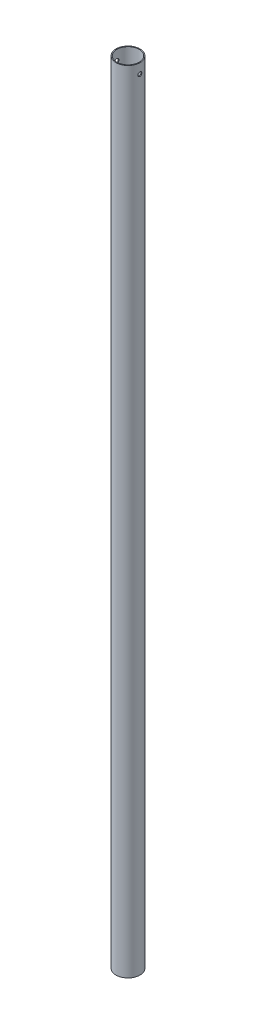
ISO-10303-21;
HEADER;
FILE_DESCRIPTION(('STEP AP214'),'2;1');
FILE_NAME('part.step','',(''),(''),'','','');
FILE_SCHEMA(('AUTOMOTIVE_DESIGN { 1 0 10303 214 1 1 1 1 }'));
ENDSEC;
DATA;
#1=APPLICATION_CONTEXT('core data for automotive mechanical design processes');
#2=APPLICATION_PROTOCOL_DEFINITION('international standard','automotive_design',2000,#1);
#3=PRODUCT_CONTEXT('',#1,'mechanical');
#4=PRODUCT('Part','Part','',(#3));
#5=PRODUCT_RELATED_PRODUCT_CATEGORY('part','',(#4));
#6=PRODUCT_DEFINITION_FORMATION('','',#4);
#7=PRODUCT_DEFINITION_CONTEXT('part definition',#1,'design');
#8=PRODUCT_DEFINITION('design','',#6,#7);
#9=PRODUCT_DEFINITION_SHAPE('','',#8);
#10=(LENGTH_UNIT() NAMED_UNIT(*) SI_UNIT(.MILLI.,.METRE.));
#11=(NAMED_UNIT(*) PLANE_ANGLE_UNIT() SI_UNIT($,.RADIAN.));
#12=(NAMED_UNIT(*) SI_UNIT($,.STERADIAN.) SOLID_ANGLE_UNIT());
#13=UNCERTAINTY_MEASURE_WITH_UNIT(LENGTH_MEASURE(1.E-05),#10,'distance_accuracy_value','');
#14=(GEOMETRIC_REPRESENTATION_CONTEXT(3) GLOBAL_UNCERTAINTY_ASSIGNED_CONTEXT((#13)) GLOBAL_UNIT_ASSIGNED_CONTEXT((#10,
#11,#12)) REPRESENTATION_CONTEXT('',''));
#15=CARTESIAN_POINT('',(0.,0.,0.));
#16=DIRECTION('',(0.,0.,1.));
#17=DIRECTION('',(1.,0.,0.));
#18=AXIS2_PLACEMENT_3D('',#15,#16,#17);
#19=CARTESIAN_POINT('',(0.,990.5,0.));
#20=DIRECTION('',(0.,1.,0.));
#21=DIRECTION('',(0.,0.,1.));
#22=AXIS2_PLACEMENT_3D('',#19,#20,#21);
#23=PLANE('',#22);
#24=CARTESIAN_POINT('',(0.,990.5,0.));
#25=DIRECTION('',(0.,1.,0.));
#26=DIRECTION('',(0.,0.,1.));
#27=AXIS2_PLACEMENT_3D('',#24,#25,#26);
#28=CIRCLE('',#27,30.);
#29=CARTESIAN_POINT('',(0.,990.5,30.));
#30=VERTEX_POINT('',#29);
#31=EDGE_CURVE('E11',#30,#30,#28,.T.);
#32=ORIENTED_EDGE('',*,*,#31,.T.);
#33=EDGE_LOOP('',(#32));
#34=FACE_BOUND('',#33,.T.);
#35=CARTESIAN_POINT('',(0.,990.5,0.));
#36=DIRECTION('',(0.,1.,0.));
#37=DIRECTION('',(1.,0.,0.));
#38=AXIS2_PLACEMENT_3D('',#35,#36,#37);
#39=CIRCLE('',#38,28.);
#40=CARTESIAN_POINT('',(28.,990.5,0.));
#41=VERTEX_POINT('',#40);
#42=EDGE_CURVE('E56',#41,#41,#39,.T.);
#43=ORIENTED_EDGE('',*,*,#42,.F.);
#44=EDGE_LOOP('',(#43));
#45=FACE_BOUND('',#44,.T.);
#46=ADVANCED_FACE('F37',(#34,#45),#23,.T.);
#47=CARTESIAN_POINT('',(0.,-990.5,0.));
#48=DIRECTION('',(0.,1.,0.));
#49=DIRECTION('',(0.,0.,1.));
#50=AXIS2_PLACEMENT_3D('',#47,#48,#49);
#51=PLANE('',#50);
#52=CARTESIAN_POINT('',(0.,-990.5,0.));
#53=DIRECTION('',(0.,1.,0.));
#54=DIRECTION('',(0.,0.,1.));
#55=AXIS2_PLACEMENT_3D('',#52,#53,#54);
#56=CIRCLE('',#55,30.);
#57=CARTESIAN_POINT('',(0.,-990.5,30.));
#58=VERTEX_POINT('',#57);
#59=EDGE_CURVE('E51',#58,#58,#56,.T.);
#60=ORIENTED_EDGE('',*,*,#59,.F.);
#61=EDGE_LOOP('',(#60));
#62=FACE_BOUND('',#61,.T.);
#63=CARTESIAN_POINT('',(0.,-990.5,0.));
#64=DIRECTION('',(0.,1.,0.));
#65=DIRECTION('',(1.,0.,0.));
#66=AXIS2_PLACEMENT_3D('',#63,#64,#65);
#67=CIRCLE('',#66,28.);
#68=CARTESIAN_POINT('',(28.,-990.5,0.));
#69=VERTEX_POINT('',#68);
#70=EDGE_CURVE('E59',#69,#69,#67,.T.);
#71=ORIENTED_EDGE('',*,*,#70,.T.);
#72=EDGE_LOOP('',(#71));
#73=FACE_BOUND('',#72,.T.);
#74=ADVANCED_FACE('F95',(#62,#73),#51,.F.);
#75=CARTESIAN_POINT('',(0.,990.5,0.));
#76=DIRECTION('',(0.,-1.,0.));
#77=DIRECTION('',(0.,0.,-1.));
#78=AXIS2_PLACEMENT_3D('',#75,#76,#77);
#79=CYLINDRICAL_SURFACE('',#78,30.);
#80=CARTESIAN_POINT('',(-30.,960.5,0.));
#81=CARTESIAN_POINT('',(-30.0000009341092,960.499997851397,-0.139438730306518));
#82=CARTESIAN_POINT('',(-29.9990260400444,960.505834755648,-0.27884837499536));
#83=CARTESIAN_POINT('',(-29.9951557115238,960.529134183502,-0.556708896140978));
#84=CARTESIAN_POINT('',(-29.9922598968632,960.546599008604,-0.695159577308843));
#85=CARTESIAN_POINT('',(-29.9846251699259,960.593038812898,-0.97015052034416));
#86=CARTESIAN_POINT('',(-29.979885095025,960.622021052932,-1.10668952072417));
#87=CARTESIAN_POINT('',(-29.9686930297133,960.691286055406,-1.37685247096437));
#88=CARTESIAN_POINT('',(-29.9622404112013,960.731572964316,-1.51047533178691));
#89=CARTESIAN_POINT('',(-29.9478128865369,960.823085001361,-1.77365528085701));
#90=CARTESIAN_POINT('',(-29.9398398129292,960.874296970678,-1.90321704710933));
#91=CARTESIAN_POINT('',(-29.9225843720657,960.987331768374,-2.15759207174612));
#92=CARTESIAN_POINT('',(-29.9133015225275,961.049158507121,-2.28240355940388));
#93=CARTESIAN_POINT('',(-29.8936901460056,961.182931112383,-2.52631223217167));
#94=CARTESIAN_POINT('',(-29.8833621400859,961.254871943398,-2.6454122215292));
#95=CARTESIAN_POINT('',(-29.8619368035706,961.408417322423,-2.8772007594364));
#96=CARTESIAN_POINT('',(-29.8508391875783,961.490025463417,-2.98988690101173));
#97=CARTESIAN_POINT('',(-29.8280901061561,961.66302595166,-3.20893550320273));
#98=CARTESIAN_POINT('',(-29.8164348485225,961.754492970354,-3.31523860199372));
#99=CARTESIAN_POINT('',(-29.792977049997,961.946055893728,-3.51981905081328));
#100=CARTESIAN_POINT('',(-29.7811744561748,962.046154980491,-3.61809341494841));
#101=CARTESIAN_POINT('',(-29.757760553176,962.254234434271,-3.80586900468398));
#102=CARTESIAN_POINT('',(-29.7461491869625,962.362212397114,-3.89537288715648));
#103=CARTESIAN_POINT('',(-29.7234367117224,962.58537924259,-4.06505128766862));
#104=CARTESIAN_POINT('',(-29.7123357924676,962.700570770057,-4.14522235269035));
#105=CARTESIAN_POINT('',(-29.6909016370194,962.938028525306,-4.29606801839333));
#106=CARTESIAN_POINT('',(-29.6805732300208,963.060331931777,-4.36668480543057));
#107=CARTESIAN_POINT('',(-29.6610510502017,963.310589086649,-4.49737903615683));
#108=CARTESIAN_POINT('',(-29.6518577016161,963.438544923565,-4.55745254274494));
#109=CARTESIAN_POINT('',(-29.6348831234285,963.699119311015,-4.66655756396112));
#110=CARTESIAN_POINT('',(-29.6271012976113,963.831735864512,-4.71559374278068));
#111=CARTESIAN_POINT('',(-29.6131700678879,964.100732309735,-4.80229722760726));
#112=CARTESIAN_POINT('',(-29.6070212600786,964.237113555679,-4.83996038282923));
#113=CARTESIAN_POINT('',(-29.5914227981395,964.647801475856,-4.93477467758656));
#114=CARTESIAN_POINT('',(-29.5846386003063,964.92636886537,-4.97488357358491));
#115=CARTESIAN_POINT('',(-29.5790755483693,965.486203158384,-5.00784793424049));
#116=CARTESIAN_POINT('',(-29.5802961277241,965.767469869432,-5.00070674304216));
#117=CARTESIAN_POINT('',(-29.590529429811,966.321844478573,-4.93978637434364));
#118=CARTESIAN_POINT('',(-29.5994616948564,966.595006593739,-4.88648873937529));
#119=CARTESIAN_POINT('',(-29.6239896757343,967.128445649112,-4.73550730524637));
#120=CARTESIAN_POINT('',(-29.6395856201047,967.388722147052,-4.63782198375661));
#121=CARTESIAN_POINT('',(-29.6757696483376,967.890456833719,-4.40035421574886));
#122=CARTESIAN_POINT('',(-29.6963813586744,968.131818594179,-4.26037175365467));
#123=CARTESIAN_POINT('',(-29.7402583517709,968.587809019078,-3.94242410922574));
#124=CARTESIAN_POINT('',(-29.7635238486315,968.802435523655,-3.76445586128017));
#125=CARTESIAN_POINT('',(-29.8104405621052,969.201652112141,-3.37296440409904));
#126=CARTESIAN_POINT('',(-29.8340929858412,969.38583702115,-3.1590279223279));
#127=CARTESIAN_POINT('',(-29.8788520267263,969.715755541261,-2.70307050338167));
#128=CARTESIAN_POINT('',(-29.8999586274719,969.861488904615,-2.46104938526712));
#129=CARTESIAN_POINT('',(-29.9372778581815,970.11040445002,-1.95541183087798));
#130=CARTESIAN_POINT('',(-29.9534863682324,970.213550837604,-1.69177745073246));
#131=CARTESIAN_POINT('',(-29.9791500601698,970.37398843155,-1.15059669160241));
#132=CARTESIAN_POINT('',(-29.988605806999,970.431283473929,-0.873051478491212));
#133=CARTESIAN_POINT('',(-29.999622596864,970.497842716941,-0.315419802472582));
#134=CARTESIAN_POINT('',(-30.0012750602153,970.507663144718,-0.035401474169993));
#135=CARTESIAN_POINT('',(-29.9967494884638,970.480477310037,0.52227954564772));
#136=CARTESIAN_POINT('',(-29.9905717546544,970.443472849323,0.799942327386585));
#137=CARTESIAN_POINT('',(-29.971136538593,970.324150305711,1.34331235148858));
#138=CARTESIAN_POINT('',(-29.9579220953842,970.242107599602,1.6090817382158));
#139=CARTESIAN_POINT('',(-29.9258892897492,970.035330947217,2.12309376827572));
#140=CARTESIAN_POINT('',(-29.9070706126377,969.910594603576,2.3713354264338));
#141=CARTESIAN_POINT('',(-29.8656903236297,969.620697812301,2.84566138437112));
#142=CARTESIAN_POINT('',(-29.8430971086773,969.455189918858,3.07153052223235));
#143=CARTESIAN_POINT('',(-29.7967693569018,969.088925138021,3.4924871506458));
#144=CARTESIAN_POINT('',(-29.7730347372687,968.88816569028,3.68757240338598));
#145=CARTESIAN_POINT('',(-29.7268034705286,968.454605775965,4.04348563611059));
#146=CARTESIAN_POINT('',(-29.7043221945332,968.221494939448,4.20393781021316));
#147=CARTESIAN_POINT('',(-29.6634307237625,967.73129079135,4.48340433261343));
#148=CARTESIAN_POINT('',(-29.6450203999454,967.474198240312,4.60241999444136));
#149=CARTESIAN_POINT('',(-29.6144685973239,966.944432692722,4.79507773356381));
#150=CARTESIAN_POINT('',(-29.602301310812,966.671829098809,4.86890685306044));
#151=CARTESIAN_POINT('',(-29.5855561119601,966.117714456625,4.96966691993878));
#152=CARTESIAN_POINT('',(-29.580977539818,965.836204184916,4.99660194454599));
#153=CARTESIAN_POINT('',(-29.5801885462874,965.415590216582,5.00123212445091));
#154=CARTESIAN_POINT('',(-29.5809172344068,965.276463077976,4.99693975789019));
#155=CARTESIAN_POINT('',(-29.5843160283654,964.999087415514,4.97678436801742));
#156=CARTESIAN_POINT('',(-29.5869854047428,964.860838581215,4.96092569221814));
#157=CARTESIAN_POINT('',(-29.5941926651669,964.586152210723,4.91774640529923));
#158=CARTESIAN_POINT('',(-29.5987312164982,964.449715339365,4.89042170080806));
#159=CARTESIAN_POINT('',(-29.6095423170401,964.179703545125,4.82453301754962));
#160=CARTESIAN_POINT('',(-29.615814242021,964.046127610574,4.78597308458853));
#161=CARTESIAN_POINT('',(-29.6299071307842,963.782831394878,4.69793428640033));
#162=CARTESIAN_POINT('',(-29.6377268263816,963.653108056479,4.64846435664854));
#163=CARTESIAN_POINT('',(-29.6546930297384,963.398341273562,4.53896986674986));
#164=CARTESIAN_POINT('',(-29.6638390620139,963.273296172049,4.47894908739064));
#165=CARTESIAN_POINT('',(-29.6832065043881,963.028638549201,4.34874498523016));
#166=CARTESIAN_POINT('',(-29.6934283356131,962.909028181745,4.27855767862005));
#167=CARTESIAN_POINT('',(-29.7146554589665,962.676138474368,4.12855715704196));
#168=CARTESIAN_POINT('',(-29.7256604751555,962.562856929479,4.04874732556533));
#169=CARTESIAN_POINT('',(-29.7482907408856,962.341991301298,3.87899685367999));
#170=CARTESIAN_POINT('',(-29.7599219326499,962.234493909896,3.78894418512198));
#171=CARTESIAN_POINT('',(-29.783347263822,962.027486603521,3.60017574898992));
#172=CARTESIAN_POINT('',(-29.7951413435574,961.927973849904,3.50146308651917));
#173=CARTESIAN_POINT('',(-29.8185735949796,961.737518070023,3.29596225179818));
#174=CARTESIAN_POINT('',(-29.8302116694714,961.646580190969,3.18916929766625));
#175=CARTESIAN_POINT('',(-29.8529952569281,961.474004283895,2.96833108680551));
#176=CARTESIAN_POINT('',(-29.8641409501131,961.392362835665,2.85428852146922));
#177=CARTESIAN_POINT('',(-29.8857116363867,961.238354969589,2.6188382428721));
#178=CARTESIAN_POINT('',(-29.896130775176,961.166060601068,2.49738284629917));
#179=CARTESIAN_POINT('',(-29.9158586577262,961.032003252814,2.24876507402075));
#180=CARTESIAN_POINT('',(-29.925167809621,960.970236398583,2.12160481976541));
#181=CARTESIAN_POINT('',(-29.9424090895346,960.857699293732,1.86251821435406));
#182=CARTESIAN_POINT('',(-29.950342172599,960.806921410225,1.73059524615481));
#183=CARTESIAN_POINT('',(-29.9646113279921,960.716705181105,1.46288984328886));
#184=CARTESIAN_POINT('',(-29.9709477429356,960.677264402506,1.3271082435821));
#185=CARTESIAN_POINT('',(-29.9841083147641,960.59602169883,0.995492141379865));
#186=CARTESIAN_POINT('',(-29.9900398634941,960.560056342968,0.798161887183521));
#187=CARTESIAN_POINT('',(-29.9979850016837,960.512047242201,0.400534394814466));
#188=CARTESIAN_POINT('',(-29.9999986585978,960.500003085443,0.200237207783453));
#189=CARTESIAN_POINT('',(-30.,960.5,0.));
#190=B_SPLINE_CURVE_WITH_KNOTS('',3,(#80,#81,#82,#83,#84,#85,#86,#87,#88,#89,#90,#91,#92,#93,
#94,#95,#96,#97,#98,#99,#100,#101,#102,#103,#104,#105,#106,#107,#108,#109,#110,#111,#112,#113,
#114,#115,#116,#117,#118,#119,#120,#121,#122,#123,#124,#125,#126,#127,#128,#129,#130,#131,#132,
#133,#134,#135,#136,#137,#138,#139,#140,#141,#142,#143,#144,#145,#146,#147,#148,#149,#150,#151,
#152,#153,#154,#155,#156,#157,#158,#159,#160,#161,#162,#163,#164,#165,#166,#167,#168,#169,#170,
#171,#172,#173,#174,#175,#176,#177,#178,#179,#180,#181,#182,#183,#184,#185,#186,#187,#188,#189),
.UNSPECIFIED.,.T.,.F.,(4,2,2,2,2,2,2,2,2,2,2,2,2,2,2,2,2,2,2,2,2,2,2,2,2,2,2,2,2,2,2,2,2,2,2,2,
2,2,2,2,2,2,2,2,2,2,2,2,2,2,2,2,2,2,4),(0.,0.41814067763632,0.836364141924735,1.25485168316259,
1.67349292366113,2.0916327453657,2.50992693714586,2.92801360569253,3.34625615217359,
3.76792473637704,4.18974943231202,4.61144594582067,5.03329798883919,5.45759827861691,
5.88205667621394,6.30633536657084,6.73076871826466,7.57090272280942,8.41097726715884,
9.24239161594911,10.0738344812487,10.9092723133921,11.7447775943526,12.5906365789677,
13.436501013458,14.2830749590591,15.1295780711641,15.9661388505691,16.8026674414583,
17.6341373208694,18.4656538972624,19.3045176932816,20.1434424418268,20.9910576208936,
21.83864592826,22.6827016275766,23.5266839364735,23.9438629667131,24.3608852695981,
24.7780565762498,25.1950778447662,25.6117588257789,26.0282907967258,26.4449864317717,
26.8615359724481,27.2831832626948,27.7046799813851,28.1264281209232,28.5480205921467,
28.9726903230862,29.3972034214197,29.8214207018257,30.2455468755531,30.8460167962321,
31.4464763784911),.UNSPECIFIED.);
#191=CARTESIAN_POINT('',(-30.,960.5,0.));
#192=VERTEX_POINT('',#191);
#193=EDGE_CURVE('E84',#192,#192,#190,.T.);
#194=ORIENTED_EDGE('',*,*,#193,.T.);
#195=EDGE_LOOP('',(#194));
#196=FACE_BOUND('',#195,.T.);
#197=CARTESIAN_POINT('',(29.5803989154981,965.5,-5.00000000000001));
#198=CARTESIAN_POINT('',(29.5803979326159,965.360576396262,-5.00000215212788));
#199=CARTESIAN_POINT('',(29.5813865662228,965.221181880358,-4.99416650120511));
#200=CARTESIAN_POINT('',(29.5853101778166,964.943352026624,-4.97087220441201));
#201=CARTESIAN_POINT('',(29.5882455414312,964.804916884328,-4.95341125568433));
#202=CARTESIAN_POINT('',(29.595980767529,964.529957352483,-4.90698205316679));
#203=CARTESIAN_POINT('',(29.6007818099767,964.393434228934,-4.87800651661559));
#204=CARTESIAN_POINT('',(29.6121103008977,964.12330337378,-4.80875805511331));
#205=CARTESIAN_POINT('',(29.618638383252,963.98969673215,-4.76848098179352));
#206=CARTESIAN_POINT('',(29.6332225751521,963.726551289933,-4.67699269476573));
#207=CARTESIAN_POINT('',(29.6412768169069,963.597007740269,-4.62579483693732));
#208=CARTESIAN_POINT('',(29.6586914491271,963.342667598529,-4.51279168660922));
#209=CARTESIAN_POINT('',(29.6680523207879,963.217872776923,-4.45098248431029));
#210=CARTESIAN_POINT('',(29.6878078821124,962.973994486096,-4.31724764429025));
#211=CARTESIAN_POINT('',(29.6982020583187,962.854908223419,-4.24532702372851));
#212=CARTESIAN_POINT('',(29.7197406344104,962.623143403145,-4.09182393832119));
#213=CARTESIAN_POINT('',(29.7308853125904,962.510467251377,-4.01023788081431));
#214=CARTESIAN_POINT('',(29.7537075193766,962.291405187077,-3.83725956163015));
#215=CARTESIAN_POINT('',(29.765388757594,962.185080538645,-3.7457901948867));
#216=CARTESIAN_POINT('',(29.7888712088753,961.98045677902,-3.55421801378067));
#217=CARTESIAN_POINT('',(29.8006724647591,961.882160653901,-3.45411201537787));
#218=CARTESIAN_POINT('',(29.8240565154478,961.694342466883,-3.24601440777822));
#219=CARTESIAN_POINT('',(29.8356393762872,961.604817717345,-3.13802523187877));
#220=CARTESIAN_POINT('',(29.8582708932577,961.435099163083,-2.91483167477466));
#221=CARTESIAN_POINT('',(29.8693193508737,961.35490881049,-2.79962464827635));
#222=CARTESIAN_POINT('',(29.8906281533999,961.204041140909,-2.56215441101309));
#223=CARTESIAN_POINT('',(29.9008837226048,961.133419792008,-2.4398551986927));
#224=CARTESIAN_POINT('',(29.9202504077895,961.002716002867,-2.18960603977589));
#225=CARTESIAN_POINT('',(29.9293610959132,960.94263749931,-2.06165400465139));
#226=CARTESIAN_POINT('',(29.9461700436224,960.833522236651,-1.80108735309578));
#227=CARTESIAN_POINT('',(29.9538688966168,960.784480836562,-1.66847472361842));
#228=CARTESIAN_POINT('',(29.9676431912185,960.697766756876,-1.39948700260425));
#229=CARTESIAN_POINT('',(29.9737180397443,960.660098229971,-1.26311055653701));
#230=CARTESIAN_POINT('',(29.9891228124451,960.565269031055,-0.852446509264983));
#231=CARTESIAN_POINT('',(29.9958138795881,960.525148659063,-0.573900376996239));
#232=CARTESIAN_POINT('',(30.0013047692693,960.492154001607,-0.0141079703099824));
#233=CARTESIAN_POINT('',(30.000105128181,960.499276504794,0.267138119279332));
#234=CARTESIAN_POINT('',(29.9900163282399,960.56016652949,0.821593120474296));
#235=CARTESIAN_POINT('',(29.9812034486287,960.613471352281,1.09485404654844));
#236=CARTESIAN_POINT('',(29.9569598006588,960.764501122999,1.62848697416716));
#237=CARTESIAN_POINT('',(29.9415288307432,960.862227423808,1.8888585828924));
#238=CARTESIAN_POINT('',(29.9056539094833,961.099781557263,2.39071148226921));
#239=CARTESIAN_POINT('',(29.885187330251,961.239800098321,2.63210082802066));
#240=CARTESIAN_POINT('',(29.8415147777179,961.557825571108,3.08813127772831));
#241=CARTESIAN_POINT('',(29.8183085827714,961.735835577439,3.30277021457951));
#242=CARTESIAN_POINT('',(29.77140536021,962.127357633464,3.70194248743279));
#243=CARTESIAN_POINT('',(29.7477057934308,962.341274195222,3.88607898857915));
#244=CARTESIAN_POINT('',(29.7027591968862,962.797174175011,4.21590919282352));
#245=CARTESIAN_POINT('',(29.6815121897447,963.039157851911,4.3616025413131));
#246=CARTESIAN_POINT('',(29.6438750909177,963.544783285212,4.61048886472354));
#247=CARTESIAN_POINT('',(29.6274904659697,963.808448996581,4.71363405349993));
#248=CARTESIAN_POINT('',(29.6015237738799,964.349698144218,4.87405974268971));
#249=CARTESIAN_POINT('',(29.5919411077771,964.627280352733,4.93134428151734));
#250=CARTESIAN_POINT('',(29.5807791884317,965.184932312455,4.99786376977689));
#251=CARTESIAN_POINT('',(29.5791057152116,965.464932759536,5.0076644169312));
#252=CARTESIAN_POINT('',(29.583700695609,966.02257334325,4.98044540425866));
#253=CARTESIAN_POINT('',(29.5899688424735,966.300213570631,4.94342755284268));
#254=CARTESIAN_POINT('',(29.6096537492629,966.843455518776,4.82410467423496));
#255=CARTESIAN_POINT('',(29.6230250389774,967.109122281198,4.74208759766015));
#256=CARTESIAN_POINT('',(29.6553714594995,967.622940331118,4.53539636401616));
#257=CARTESIAN_POINT('',(29.6743469255321,967.87109056973,4.41071965510571));
#258=CARTESIAN_POINT('',(29.7159825702484,968.345349194234,4.12091340811817));
#259=CARTESIAN_POINT('',(29.7386751206295,968.571233165831,3.95542135942321));
#260=CARTESIAN_POINT('',(29.7850933249741,968.992227045069,3.58917870029519));
#261=CARTESIAN_POINT('',(29.8088190515135,969.187334786356,3.38842560992095));
#262=CARTESIAN_POINT('',(29.8549284748932,969.543303862109,2.95485701247837));
#263=CARTESIAN_POINT('',(29.8772956488783,969.703787940026,2.72172977623547));
#264=CARTESIAN_POINT('',(29.9179021266779,969.983310366562,2.23148362654157));
#265=CARTESIAN_POINT('',(29.9361415640095,970.102350055822,1.97436548948835));
#266=CARTESIAN_POINT('',(29.9663676167788,970.295022236316,1.44461025477477));
#267=CARTESIAN_POINT('',(29.9783813800026,970.368852130772,1.1720463847414));
#268=CARTESIAN_POINT('',(29.9949099748744,970.469627218953,0.618016213936846));
#269=CARTESIAN_POINT('',(29.999425423549,970.496576270453,0.336550647617436));
#270=CARTESIAN_POINT('',(30.0002084581204,970.501239001663,-0.0840513236234776));
#271=CARTESIAN_POINT('',(29.999491569583,970.496955250037,-0.223209655690172));
#272=CARTESIAN_POINT('',(29.9961418479859,970.476811799166,-0.500648669793277));
#273=CARTESIAN_POINT('',(29.9935097346187,970.460956448226,-0.638929661828186));
#274=CARTESIAN_POINT('',(29.9863985702464,970.417778301235,-0.913680965571314));
#275=CARTESIAN_POINT('',(29.9819188631118,970.390451431282,-1.05015061623523));
#276=CARTESIAN_POINT('',(29.9712403869649,970.324552637904,-1.32022824391749));
#277=CARTESIAN_POINT('',(29.9650422374513,970.285984766604,-1.45383723354139));
#278=CARTESIAN_POINT('',(29.95110323313,970.197922026297,-1.71720548972896));
#279=CARTESIAN_POINT('',(29.9433635637899,970.14843555084,-1.84696762706267));
#280=CARTESIAN_POINT('',(29.9265550855046,970.038901336116,-2.10180951631917));
#281=CARTESIAN_POINT('',(29.9174867532583,969.978857383134,-2.22689092747554));
#282=CARTESIAN_POINT('',(29.8982638774694,969.848601112338,-2.47161697545374));
#283=CARTESIAN_POINT('',(29.8881089104257,969.778384826198,-2.59125946645752));
#284=CARTESIAN_POINT('',(29.8669972490416,969.628321552099,-2.82420799916345));
#285=CARTESIAN_POINT('',(29.8560408372885,969.548477952327,-2.93751624967612));
#286=CARTESIAN_POINT('',(29.8334892153085,969.378690446336,-3.15838432816086));
#287=CARTESIAN_POINT('',(29.8218879813952,969.288638226688,-3.26586029407922));
#288=CARTESIAN_POINT('',(29.7984955265668,969.09987513112,-3.47282432265102));
#289=CARTESIAN_POINT('',(29.7867043749739,969.001167358622,-3.57231522401808));
#290=CARTESIAN_POINT('',(29.7632506471209,968.795680670506,-3.76272784850016));
#291=CARTESIAN_POINT('',(29.7515881521716,968.688896952148,-3.85364439911048));
#292=CARTESIAN_POINT('',(29.7287311492829,968.468081544253,-4.02617893630586));
#293=CARTESIAN_POINT('',(29.7175364703669,968.3540525418,-4.10780033921654));
#294=CARTESIAN_POINT('',(29.6958464681929,968.118613436289,-4.26178317336446));
#295=CARTESIAN_POINT('',(29.6853569910252,967.997154577476,-4.33407091155744));
#296=CARTESIAN_POINT('',(29.6654772768531,967.748530651649,-4.46811470952362));
#297=CARTESIAN_POINT('',(29.6560866358151,967.621367705925,-4.52987464412771));
#298=CARTESIAN_POINT('',(29.6386805621146,967.36227598754,-4.64239786264881));
#299=CARTESIAN_POINT('',(29.6306641722598,967.230350610174,-4.69316880713278));
#300=CARTESIAN_POINT('',(29.6162360630624,966.96263975731,-4.7833713057041));
#301=CARTESIAN_POINT('',(29.6098239987682,966.826855118609,-4.82280529766024));
#302=CARTESIAN_POINT('',(29.596502515164,966.495277925421,-4.90401989376));
#303=CARTESIAN_POINT('',(29.5904931161671,966.297990596502,-4.93996956730933));
#304=CARTESIAN_POINT('',(29.5824420579954,965.900448818702,-4.98795785830044));
#305=CARTESIAN_POINT('',(29.5804003267909,965.700194423752,-4.99999690982025));
#306=CARTESIAN_POINT('',(29.5803989154981,965.5,-5.00000000000001));
#307=B_SPLINE_CURVE_WITH_KNOTS('',3,(#197,#198,#199,#200,#201,#202,#203,#204,#205,#206,#207,
#208,#209,#210,#211,#212,#213,#214,#215,#216,#217,#218,#219,#220,#221,#222,#223,#224,#225,#226,
#227,#228,#229,#230,#231,#232,#233,#234,#235,#236,#237,#238,#239,#240,#241,#242,#243,#244,#245,
#246,#247,#248,#249,#250,#251,#252,#253,#254,#255,#256,#257,#258,#259,#260,#261,#262,#263,#264,
#265,#266,#267,#268,#269,#270,#271,#272,#273,#274,#275,#276,#277,#278,#279,#280,#281,#282,#283,
#284,#285,#286,#287,#288,#289,#290,#291,#292,#293,#294,#295,#296,#297,#298,#299,#300,#301,#302,
#303,#304,#305,#306),.UNSPECIFIED.,.T.,.F.,(4,2,2,2,2,2,2,2,2,2,2,2,2,2,2,2,2,2,2,2,2,2,2,2,2,2,
2,2,2,2,2,2,2,2,2,2,2,2,2,2,2,2,2,2,2,2,2,2,2,2,2,2,2,2,4),(0.,0.418095242549684,
0.836273330312904,1.25471632992742,1.67331312559434,2.09140089204113,2.50964303678584,
2.92767838265866,3.345869603489,3.76759791918747,4.18948238202704,4.61123716813958,
5.03314743913421,5.45742771408337,5.88186607917444,6.30612563749767,6.73053992314494,
7.57061257037397,8.41062811397651,9.24232364421605,10.0740445059133,10.9095733037112,
11.745169745458,12.5909036901652,13.436645435843,14.2833344708949,15.1299489396843,
15.9664520693309,16.8029228892024,17.6341025136327,18.4653318667942,19.3042280761769,
20.1431833095364,20.9908634816303,21.8385162304567,22.6824409092756,23.5262961391698,
23.9435677338948,24.3606826095272,24.7779457414127,25.1950586450546,25.6118520083923,
26.0284961987166,26.4453033659292,26.8619642700311,27.2835543146455,27.7049938127193,
28.126685940746,28.5482225769884,28.9729067446498,29.3974342652836,29.8216648822649,
30.2458042054463,30.8461462814326,31.4464774585936),.UNSPECIFIED.);
#308=CARTESIAN_POINT('',(29.5803989154981,965.5,-5.00000000000001));
#309=VERTEX_POINT('',#308);
#310=EDGE_CURVE('E79',#309,#309,#307,.T.);
#311=ORIENTED_EDGE('',*,*,#310,.T.);
#312=EDGE_LOOP('',(#311));
#313=FACE_BOUND('',#312,.T.);
#314=ORIENTED_EDGE('',*,*,#31,.F.);
#315=EDGE_LOOP('',(#314));
#316=FACE_BOUND('',#315,.T.);
#317=ORIENTED_EDGE('',*,*,#59,.T.);
#318=EDGE_LOOP('',(#317));
#319=FACE_BOUND('',#318,.T.);
#320=ADVANCED_FACE('F39',(#196,#313,#316,#319),#79,.T.);
#321=CARTESIAN_POINT('',(0.,990.5,0.));
#322=DIRECTION('',(0.,-1.,0.));
#323=DIRECTION('',(0.,0.,-1.));
#324=AXIS2_PLACEMENT_3D('',#321,#322,#323);
#325=CYLINDRICAL_SURFACE('',#324,28.);
#326=CARTESIAN_POINT('',(-27.5499546279118,965.5,-5.00000000000001));
#327=CARTESIAN_POINT('',(-27.5499534785113,965.639267090309,-5.00000235394525));
#328=CARTESIAN_POINT('',(-27.5510126599751,965.778503213249,-4.99417968710046));
#329=CARTESIAN_POINT('',(-27.5552158522054,966.056015107577,-4.97093843407888));
#330=CARTESIAN_POINT('',(-27.558360255738,966.194290693082,-4.95351766331636));
#331=CARTESIAN_POINT('',(-27.5666457352828,966.468924724803,-4.90719805539984));
#332=CARTESIAN_POINT('',(-27.5717879996025,966.605281979904,-4.87829238691191));
#333=CARTESIAN_POINT('',(-27.5839207236134,966.875081856278,-4.80921478686572));
#334=CARTESIAN_POINT('',(-27.5909118624483,967.008523386985,-4.76903871504114));
#335=CARTESIAN_POINT('',(-27.6065289529866,967.271335237038,-4.67778760049008));
#336=CARTESIAN_POINT('',(-27.6151528151451,967.400710516241,-4.62672647794613));
#337=CARTESIAN_POINT('',(-27.6337977727396,967.654723007349,-4.51403163823147));
#338=CARTESIAN_POINT('',(-27.6438193830619,967.779358451619,-4.45239402307846));
#339=CARTESIAN_POINT('',(-27.6649685733021,968.022935291171,-4.31903543922292));
#340=CARTESIAN_POINT('',(-27.6760956233637,968.1418793743,-4.24731929456353));
#341=CARTESIAN_POINT('',(-27.6991524939337,968.3733816399,-4.09425705215796));
#342=CARTESIAN_POINT('',(-27.711082612651,968.485937421244,-4.01290736851647));
#343=CARTESIAN_POINT('',(-27.7355297067602,968.704928339126,-3.8403201822788));
#344=CARTESIAN_POINT('',(-27.7480512719506,968.81129305134,-3.74899395863677));
#345=CARTESIAN_POINT('',(-27.7732247238632,969.016011556321,-3.5577092512307));
#346=CARTESIAN_POINT('',(-27.7858766571367,969.114362367375,-3.45774758273872));
#347=CARTESIAN_POINT('',(-27.8109487865459,969.302308002275,-3.24993462722937));
#348=CARTESIAN_POINT('',(-27.8233690518608,969.391905474979,-3.14208574435405));
#349=CARTESIAN_POINT('',(-27.8476400296906,969.561788771104,-2.91916394879762));
#350=CARTESIAN_POINT('',(-27.8594905305788,969.642071150043,-2.80408838796573));
#351=CARTESIAN_POINT('',(-27.8823608982083,969.793211950455,-2.56675882950058));
#352=CARTESIAN_POINT('',(-27.8933748300241,969.864005350994,-2.44446283153361));
#353=CARTESIAN_POINT('',(-27.9141773953462,969.995051336245,-2.19419156577699));
#354=CARTESIAN_POINT('',(-27.9239655701264,970.05529997803,-2.06621419592124));
#355=CARTESIAN_POINT('',(-27.9420285438388,970.164748737473,-1.80556855851417));
#356=CARTESIAN_POINT('',(-27.9503039900596,970.213953582776,-1.67290232643799));
#357=CARTESIAN_POINT('',(-27.9651145246266,970.300983498083,-1.40377971328896));
#358=CARTESIAN_POINT('',(-27.971648978394,970.338804419382,-1.26732197019643));
#359=CARTESIAN_POINT('',(-27.988212780726,970.433978602455,-0.856746536079207));
#360=CARTESIAN_POINT('',(-27.995422125896,970.474330269703,-0.578348870457847));
#361=CARTESIAN_POINT('',(-28.0013939639513,970.507824417747,-0.0188008419929522));
#362=CARTESIAN_POINT('',(-28.0001571119632,970.500970560026,0.262349305666016));
#363=CARTESIAN_POINT('',(-27.9894550221657,970.440692654159,0.816234742859477));
#364=CARTESIAN_POINT('',(-27.9800834531563,970.387798724366,1.08902935138809));
#365=CARTESIAN_POINT('',(-27.9542657455603,970.23776205265,1.62179704102249));
#366=CARTESIAN_POINT('',(-27.9378193673122,970.140617811726,1.88176968744748));
#367=CARTESIAN_POINT('',(-27.8995430389697,969.904327750489,2.38308222368494));
#368=CARTESIAN_POINT('',(-27.8776856576117,969.764967081395,2.62431867879868));
#369=CARTESIAN_POINT('',(-27.8310092576256,969.448356796571,3.0801804998146));
#370=CARTESIAN_POINT('',(-27.8061899649772,969.271103674031,3.29480339982154));
#371=CARTESIAN_POINT('',(-27.7559361731104,968.880809755668,3.69448475893714));
#372=CARTESIAN_POINT('',(-27.7304979191709,968.66730521887,3.87909018386607));
#373=CARTESIAN_POINT('',(-27.6822051338596,968.212121589109,4.20993574078193));
#374=CARTESIAN_POINT('',(-27.6593506336834,967.970442156043,4.35617540957932));
#375=CARTESIAN_POINT('',(-27.6188090530137,967.465201902739,4.60624959232788));
#376=CARTESIAN_POINT('',(-27.6011293946448,967.201610343108,4.71002328260462));
#377=CARTESIAN_POINT('',(-27.5730566697062,966.660348375577,4.87168806226294));
#378=CARTESIAN_POINT('',(-27.5626628597676,966.382679407084,4.92958383260836));
#379=CARTESIAN_POINT('',(-27.5504843540192,965.825215808988,4.99719832412839));
#380=CARTESIAN_POINT('',(-27.548583758827,965.545502305972,5.00756567457422));
#381=CARTESIAN_POINT('',(-27.5532973691619,964.988339326097,4.98156323522329));
#382=CARTESIAN_POINT('',(-27.5599111947094,964.71088974876,4.94519553110779));
#383=CARTESIAN_POINT('',(-27.5808008649167,964.168230835083,4.82731052169665));
#384=CARTESIAN_POINT('',(-27.5950197240868,963.902946193396,4.74612886969043));
#385=CARTESIAN_POINT('',(-27.6294688283561,963.389745376983,4.54127465387027));
#386=CARTESIAN_POINT('',(-27.6496994801379,963.141830378672,4.41759921537033));
#387=CARTESIAN_POINT('',(-27.6941590073013,962.667535741828,4.1297587621799));
#388=CARTESIAN_POINT('',(-27.7184277145815,962.441410163424,3.96518138339145));
#389=CARTESIAN_POINT('',(-27.7681148582862,962.019751509308,3.60076821540068));
#390=CARTESIAN_POINT('',(-27.7935333879457,961.824220920189,3.40092956316172));
#391=CARTESIAN_POINT('',(-27.8430261700389,961.466903296362,2.96878356144963));
#392=CARTESIAN_POINT('',(-27.8670805524709,961.305550882274,2.73611425506022));
#393=CARTESIAN_POINT('',(-27.9108069263097,961.024228153642,2.24658264882748));
#394=CARTESIAN_POINT('',(-27.9304790750142,960.904256353679,1.98972121781733));
#395=CARTESIAN_POINT('',(-27.9631406686226,960.709757928253,1.46039089185689));
#396=CARTESIAN_POINT('',(-27.9761623553305,960.635011714211,1.1880045538304));
#397=CARTESIAN_POINT('',(-27.9941852090498,960.532399285306,0.634135279903124));
#398=CARTESIAN_POINT('',(-27.9991871382014,960.504528615717,0.352653210989321));
#399=CARTESIAN_POINT('',(-28.0002663085864,960.498520264034,-0.0678392147903165));
#400=CARTESIAN_POINT('',(-27.9995803509125,960.502344762964,-0.206812286370632));
#401=CARTESIAN_POINT('',(-27.9961595752054,960.521539266882,-0.483919338398537));
#402=CARTESIAN_POINT('',(-27.9934255291847,960.536904921519,-0.622053615250291));
#403=CARTESIAN_POINT('',(-27.9859800024487,960.579075467747,-0.89654980403939));
#404=CARTESIAN_POINT('',(-27.9812678249643,960.605884390125,-1.03291107399429));
#405=CARTESIAN_POINT('',(-27.9700002441596,960.670721215827,-1.30281182539596));
#406=CARTESIAN_POINT('',(-27.9634455031696,960.708745088051,-1.43635230229758));
#407=CARTESIAN_POINT('',(-27.9486814052143,960.79568039397,-1.69957891416049));
#408=CARTESIAN_POINT('',(-27.9404739046417,960.844579618762,-1.82926918782259));
#409=CARTESIAN_POINT('',(-27.9226284132306,960.952909822793,-2.084015803609));
#410=CARTESIAN_POINT('',(-27.9129909333757,961.012337041461,-2.20907378115473));
#411=CARTESIAN_POINT('',(-27.8925423085502,961.141333754325,-2.45380726107525));
#412=CARTESIAN_POINT('',(-27.881730697249,961.210907282125,-2.57348059794351));
#413=CARTESIAN_POINT('',(-27.8592350929064,961.359664076449,-2.80655032957991));
#414=CARTESIAN_POINT('',(-27.8475514049827,961.438843987947,-2.9199488957764));
#415=CARTESIAN_POINT('',(-27.8234642376222,961.60741576899,-3.141240721833));
#416=CARTESIAN_POINT('',(-27.8110531975022,961.696930527965,-3.24903956680605));
#417=CARTESIAN_POINT('',(-27.7860070572341,961.884639114421,-3.4566961147896));
#418=CARTESIAN_POINT('',(-27.7733720382322,961.98282984802,-3.55655662469795));
#419=CARTESIAN_POINT('',(-27.7482183674538,962.187309159627,-3.7477570892552));
#420=CARTESIAN_POINT('',(-27.7356997898575,962.293602549547,-3.83909190801296));
#421=CARTESIAN_POINT('',(-27.7111424985606,962.513472474413,-4.01251176535388));
#422=CARTESIAN_POINT('',(-27.6991036098079,962.627046312305,-4.0946001985588));
#423=CARTESIAN_POINT('',(-27.6757400417767,962.861755053579,-4.24966076755557));
#424=CARTESIAN_POINT('',(-27.6644224538897,962.982946939306,-4.32254776026961));
#425=CARTESIAN_POINT('',(-27.6429489673638,963.231101375899,-4.45780909310803));
#426=CARTESIAN_POINT('',(-27.6327926415015,963.358061780373,-4.52018730339402));
#427=CARTESIAN_POINT('',(-27.6139409562783,963.616820427141,-4.63396076024745));
#428=CARTESIAN_POINT('',(-27.6052446223885,963.748615370258,-4.6853633392109));
#429=CARTESIAN_POINT('',(-27.5895634992829,964.016134472429,-4.77683283379442));
#430=CARTESIAN_POINT('',(-27.5825783544449,964.15185780851,-4.81690210499024));
#431=CARTESIAN_POINT('',(-27.5678768076991,964.486724982065,-4.90048234052208));
#432=CARTESIAN_POINT('',(-27.5611901946804,964.687505889866,-4.93775483376509));
#433=CARTESIAN_POINT('',(-27.5522299966226,965.092213364841,-4.98751165650157));
#434=CARTESIAN_POINT('',(-27.5499563104123,965.296139859791,-4.99999655427852));
#435=CARTESIAN_POINT('',(-27.5499546279118,965.5,-5.00000000000001));
#436=B_SPLINE_CURVE_WITH_KNOTS('',3,(#326,#327,#328,#329,#330,#331,#332,#333,#334,#335,#336,
#337,#338,#339,#340,#341,#342,#343,#344,#345,#346,#347,#348,#349,#350,#351,#352,#353,#354,#355,
#356,#357,#358,#359,#360,#361,#362,#363,#364,#365,#366,#367,#368,#369,#370,#371,#372,#373,#374,
#375,#376,#377,#378,#379,#380,#381,#382,#383,#384,#385,#386,#387,#388,#389,#390,#391,#392,#393,
#394,#395,#396,#397,#398,#399,#400,#401,#402,#403,#404,#405,#406,#407,#408,#409,#410,#411,#412,
#413,#414,#415,#416,#417,#418,#419,#420,#421,#422,#423,#424,#425,#426,#427,#428,#429,#430,#431,
#432,#433,#434,#435),.UNSPECIFIED.,.T.,.F.,(4,2,2,2,2,2,2,2,2,2,2,2,2,2,2,2,2,2,2,2,2,2,2,2,2,2,
2,2,2,2,2,2,2,2,2,2,2,2,2,2,2,2,2,2,2,2,2,2,2,2,2,2,2,2,4),(0.,0.417622353204925,
0.835323390826618,1.25327325411103,1.67137685589556,2.08894894582653,2.50667526443109,
2.9242023169072,3.34188527703776,3.76364306704956,4.18555706966637,4.60734299829124,
5.02928439876758,5.45398346083261,5.87884098986499,6.30351629688362,6.72834618378252,
7.56810611188387,8.40780090500507,9.23795323401724,10.0681336869307,10.9026121905887,
11.737167955681,12.5833386342721,13.4295195282065,14.2769081935119,15.1242103878825,
15.9599141778617,16.7955806735397,17.6250713812727,18.4546182147402,19.2928940915836,
20.1312380635248,20.9796757797133,21.8280830368181,22.6723371660273,23.5165110586198,
23.933186837656,24.3497056326763,24.7663712638846,25.1828873110356,25.5989381076726,
26.0148405906798,26.4309088662597,26.8468322462624,27.2683427176023,27.6897034788793,
28.1113164522991,28.5327741311139,28.9578832199722,29.3828354062979,29.8075028040157,
30.232081871603,30.8434144068653,31.4547329264804),.UNSPECIFIED.);
#437=CARTESIAN_POINT('',(-27.5499546279118,965.5,-5.00000000000001));
#438=VERTEX_POINT('',#437);
#439=EDGE_CURVE('E42',#438,#438,#436,.T.);
#440=ORIENTED_EDGE('',*,*,#439,.F.);
#441=EDGE_LOOP('',(#440));
#442=FACE_BOUND('',#441,.T.);
#443=CARTESIAN_POINT('',(27.5499546279118,965.5,-5.00000000000001));
#444=CARTESIAN_POINT('',(27.5499534785113,965.360732909691,-5.00000235394524));
#445=CARTESIAN_POINT('',(27.5510126599751,965.221496786751,-4.99417968710046));
#446=CARTESIAN_POINT('',(27.5552158522054,964.943984892423,-4.97093843407887));
#447=CARTESIAN_POINT('',(27.558360255738,964.805709306918,-4.95351766331636));
#448=CARTESIAN_POINT('',(27.5666457352828,964.531075275197,-4.90719805539981));
#449=CARTESIAN_POINT('',(27.5717879996025,964.394718020096,-4.87829238691188));
#450=CARTESIAN_POINT('',(27.5839207236134,964.124918143722,-4.80921478686569));
#451=CARTESIAN_POINT('',(27.5909118624483,963.991476613015,-4.76903871504113));
#452=CARTESIAN_POINT('',(27.6065289529866,963.728664762962,-4.67778760049009));
#453=CARTESIAN_POINT('',(27.6151528151451,963.599289483759,-4.62672647794613));
#454=CARTESIAN_POINT('',(27.6337977727396,963.345276992651,-4.51403163823145));
#455=CARTESIAN_POINT('',(27.6438193830619,963.220641548381,-4.45239402307842));
#456=CARTESIAN_POINT('',(27.6649685733021,962.977064708828,-4.31903543922288));
#457=CARTESIAN_POINT('',(27.6760956233637,962.8581206257,-4.24731929456352));
#458=CARTESIAN_POINT('',(27.6991524939337,962.6266183601,-4.09425705215797));
#459=CARTESIAN_POINT('',(27.711082612651,962.514062578756,-4.01290736851647));
#460=CARTESIAN_POINT('',(27.7355297067602,962.295071660874,-3.84032018227878));
#461=CARTESIAN_POINT('',(27.7480512719506,962.188706948661,-3.74899395863674));
#462=CARTESIAN_POINT('',(27.7732247238632,961.983988443679,-3.55770925123062));
#463=CARTESIAN_POINT('',(27.7858766571367,961.885637632625,-3.4577475827386));
#464=CARTESIAN_POINT('',(27.810948786546,961.697691997725,-3.24993462722924));
#465=CARTESIAN_POINT('',(27.8233690518608,961.608094525021,-3.14208574435395));
#466=CARTESIAN_POINT('',(27.8476400296906,961.438211228896,-2.91916394879758));
#467=CARTESIAN_POINT('',(27.8594905305788,961.357928849957,-2.80408838796571));
#468=CARTESIAN_POINT('',(27.8823608982083,961.206788049545,-2.56675882950054));
#469=CARTESIAN_POINT('',(27.8933748300241,961.135994649006,-2.44446283153354));
#470=CARTESIAN_POINT('',(27.9141773953463,961.004948663755,-2.19419156577691));
#471=CARTESIAN_POINT('',(27.9239655701264,960.94470002197,-2.06621419592119));
#472=CARTESIAN_POINT('',(27.9420285438388,960.835251262527,-1.80556855851417));
#473=CARTESIAN_POINT('',(27.9503039900596,960.786046417224,-1.67290232643798));
#474=CARTESIAN_POINT('',(27.9651145246266,960.699016501917,-1.40377971328896));
#475=CARTESIAN_POINT('',(27.971648978394,960.661195580618,-1.26732197019643));
#476=CARTESIAN_POINT('',(27.988212780726,960.566021397545,-0.856746536079207));
#477=CARTESIAN_POINT('',(27.995422125896,960.525669730297,-0.578348870457847));
#478=CARTESIAN_POINT('',(28.0013939639513,960.492175582253,-0.0188008419929523));
#479=CARTESIAN_POINT('',(28.0001571119632,960.499029439975,0.262349305666016));
#480=CARTESIAN_POINT('',(27.9894550221657,960.559307345841,0.816234742859477));
#481=CARTESIAN_POINT('',(27.9800834531563,960.612201275634,1.08902935138809));
#482=CARTESIAN_POINT('',(27.9542657455603,960.76223794735,1.62179704102249));
#483=CARTESIAN_POINT('',(27.9378193673122,960.859382188274,1.88176968744748));
#484=CARTESIAN_POINT('',(27.8995430389697,961.095672249511,2.38308222368494));
#485=CARTESIAN_POINT('',(27.8776856576117,961.235032918606,2.62431867879868));
#486=CARTESIAN_POINT('',(27.8310092576256,961.551643203429,3.0801804998146));
#487=CARTESIAN_POINT('',(27.8061899649772,961.728896325969,3.29480339982154));
#488=CARTESIAN_POINT('',(27.7559361731104,962.119190244332,3.69448475893714));
#489=CARTESIAN_POINT('',(27.7304979191709,962.332694781131,3.87909018386607));
#490=CARTESIAN_POINT('',(27.6822051338596,962.787878410891,4.20993574078193));
#491=CARTESIAN_POINT('',(27.6593506336834,963.029557843957,4.35617540957933));
#492=CARTESIAN_POINT('',(27.6188090530137,963.534798097261,4.60624959232784));
#493=CARTESIAN_POINT('',(27.6011293946448,963.798389656892,4.71002328260454));
#494=CARTESIAN_POINT('',(27.5730566697062,964.339651624423,4.87168806226288));
#495=CARTESIAN_POINT('',(27.5626628597676,964.617320592916,4.92958383260835));
#496=CARTESIAN_POINT('',(27.5504843540192,965.174784191012,4.99719832412839));
#497=CARTESIAN_POINT('',(27.548583758827,965.454497694028,5.00756567457421));
#498=CARTESIAN_POINT('',(27.5532973691619,966.011660673903,4.98156323522331));
#499=CARTESIAN_POINT('',(27.5599111947094,966.28911025124,4.94519553110781));
#500=CARTESIAN_POINT('',(27.5808008649167,966.831769164918,4.82731052169663));
#501=CARTESIAN_POINT('',(27.5950197240868,967.097053806605,4.74612886969034));
#502=CARTESIAN_POINT('',(27.6294688283561,967.610254623017,4.54127465387014));
#503=CARTESIAN_POINT('',(27.6496994801379,967.858169621328,4.41759921537025));
#504=CARTESIAN_POINT('',(27.6941590073014,968.332464258172,4.12975876217987));
#505=CARTESIAN_POINT('',(27.7184277145815,968.558589836577,3.96518138339141));
#506=CARTESIAN_POINT('',(27.7681148582862,968.980248490692,3.60076821540061));
#507=CARTESIAN_POINT('',(27.7935333879457,969.175779079811,3.40092956316166));
#508=CARTESIAN_POINT('',(27.8430261700389,969.533096703638,2.9687835614496));
#509=CARTESIAN_POINT('',(27.8670805524709,969.694449117726,2.7361142550602));
#510=CARTESIAN_POINT('',(27.9108069263097,969.975771846359,2.24658264882746));
#511=CARTESIAN_POINT('',(27.9304790750142,970.095743646322,1.98972121781731));
#512=CARTESIAN_POINT('',(27.9631406686226,970.290242071747,1.46039089185689));
#513=CARTESIAN_POINT('',(27.9761623553305,970.364988285789,1.1880045538304));
#514=CARTESIAN_POINT('',(27.9941852090498,970.467600714694,0.634135279903126));
#515=CARTESIAN_POINT('',(27.9991871382014,970.495471384283,0.352653210989321));
#516=CARTESIAN_POINT('',(28.0002663085864,970.501479735966,-0.0678392147903114));
#517=CARTESIAN_POINT('',(27.9995803509125,970.497655237036,-0.206812286370621));
#518=CARTESIAN_POINT('',(27.9961595752054,970.478460733118,-0.483919338398515));
#519=CARTESIAN_POINT('',(27.9934255291847,970.463095078481,-0.622053615250265));
#520=CARTESIAN_POINT('',(27.9859800024487,970.420924532253,-0.896549804039356));
#521=CARTESIAN_POINT('',(27.9812678249643,970.394115609875,-1.03291107399426));
#522=CARTESIAN_POINT('',(27.9700002441596,970.329278784173,-1.30281182539593));
#523=CARTESIAN_POINT('',(27.9634455031696,970.291254911949,-1.43635230229757));
#524=CARTESIAN_POINT('',(27.9486814052143,970.20431960603,-1.69957891416046));
#525=CARTESIAN_POINT('',(27.9404739046417,970.155420381238,-1.82926918782252));
#526=CARTESIAN_POINT('',(27.9226284132306,970.047090177207,-2.08401580360889));
#527=CARTESIAN_POINT('',(27.9129909333757,969.987662958539,-2.20907378115462));
#528=CARTESIAN_POINT('',(27.8925423085502,969.858666245675,-2.45380726107514));
#529=CARTESIAN_POINT('',(27.881730697249,969.789092717875,-2.57348059794339));
#530=CARTESIAN_POINT('',(27.8592350929064,969.640335923551,-2.80655032957983));
#531=CARTESIAN_POINT('',(27.8475514049827,969.561156012053,-2.91994889577638));
#532=CARTESIAN_POINT('',(27.8234642376222,969.39258423101,-3.141240721833));
#533=CARTESIAN_POINT('',(27.8110531975022,969.303069472035,-3.24903956680602));
#534=CARTESIAN_POINT('',(27.7860070572341,969.115360885579,-3.45669611478952));
#535=CARTESIAN_POINT('',(27.7733720382322,969.01717015198,-3.55655662469786));
#536=CARTESIAN_POINT('',(27.7482183674538,968.812690840373,-3.74775708925515));
#537=CARTESIAN_POINT('',(27.7356997898575,968.706397450453,-3.83909190801296));
#538=CARTESIAN_POINT('',(27.7111424985606,968.486527525587,-4.01251176535391));
#539=CARTESIAN_POINT('',(27.6991036098079,968.372953687695,-4.09460019855881));
#540=CARTESIAN_POINT('',(27.6757400417767,968.138244946421,-4.24966076755557));
#541=CARTESIAN_POINT('',(27.6644224538897,968.017053060694,-4.32254776026961));
#542=CARTESIAN_POINT('',(27.6429489673638,967.768898624101,-4.45780909310804));
#543=CARTESIAN_POINT('',(27.6327926415015,967.641938219627,-4.52018730339402));
#544=CARTESIAN_POINT('',(27.6139409562783,967.383179572859,-4.63396076024748));
#545=CARTESIAN_POINT('',(27.6052446223885,967.251384629742,-4.68536333921095));
#546=CARTESIAN_POINT('',(27.5895634992829,966.983865527571,-4.77683283379446));
#547=CARTESIAN_POINT('',(27.5825783544449,966.84814219149,-4.81690210499026));
#548=CARTESIAN_POINT('',(27.5678768076991,966.513275017935,-4.90048234052208));
#549=CARTESIAN_POINT('',(27.5611901946804,966.312494110134,-4.93775483376509));
#550=CARTESIAN_POINT('',(27.5522299966226,965.907786635159,-4.98751165650157));
#551=CARTESIAN_POINT('',(27.5499563104123,965.703860140209,-4.99999655427852));
#552=CARTESIAN_POINT('',(27.5499546279118,965.5,-5.00000000000001));
#553=B_SPLINE_CURVE_WITH_KNOTS('',3,(#443,#444,#445,#446,#447,#448,#449,#450,#451,#452,#453,
#454,#455,#456,#457,#458,#459,#460,#461,#462,#463,#464,#465,#466,#467,#468,#469,#470,#471,#472,
#473,#474,#475,#476,#477,#478,#479,#480,#481,#482,#483,#484,#485,#486,#487,#488,#489,#490,#491,
#492,#493,#494,#495,#496,#497,#498,#499,#500,#501,#502,#503,#504,#505,#506,#507,#508,#509,#510,
#511,#512,#513,#514,#515,#516,#517,#518,#519,#520,#521,#522,#523,#524,#525,#526,#527,#528,#529,
#530,#531,#532,#533,#534,#535,#536,#537,#538,#539,#540,#541,#542,#543,#544,#545,#546,#547,#548,
#549,#550,#551,#552),.UNSPECIFIED.,.T.,.F.,(4,2,2,2,2,2,2,2,2,2,2,2,2,2,2,2,2,2,2,2,2,2,2,2,2,2,
2,2,2,2,2,2,2,2,2,2,2,2,2,2,2,2,2,2,2,2,2,2,2,2,2,2,2,2,4),(0.,0.417622353204925,
0.83532339082673,1.25327325411104,1.67137685589556,2.08894894582653,2.50667526443121,
2.9242023169073,3.34188527703776,3.76364306704959,4.18555706966657,4.60734299829128,
5.02928439876758,5.45398346083278,5.87884098986498,6.30351629688362,6.72834618378252,
7.56810611188386,8.40780090500507,9.23795323401724,10.0681336869307,10.9026121905887,
11.737167955681,12.5833386342721,13.4295195282065,14.2769081935116,15.1242103878825,
15.9599141778615,16.7955806735397,17.6250713812731,18.4546182147402,19.2928940915839,
20.1312380635248,20.9796757797134,21.8280830368181,22.6723371660273,23.5165110586198,
23.933186837656,24.3497056326762,24.7663712638846,25.1828873110356,25.5989381076726,
26.0148405906797,26.4309088662596,26.8468322462624,27.2683427176022,27.6897034788792,
28.1113164522992,28.5327741311139,28.9578832199722,29.3828354062979,29.8075028040159,
30.232081871603,30.8434144068653,31.4547329264805),.UNSPECIFIED.);
#554=CARTESIAN_POINT('',(27.5499546279118,965.5,-5.00000000000001));
#555=VERTEX_POINT('',#554);
#556=EDGE_CURVE('E61',#555,#555,#553,.T.);
#557=ORIENTED_EDGE('',*,*,#556,.F.);
#558=EDGE_LOOP('',(#557));
#559=FACE_BOUND('',#558,.T.);
#560=ORIENTED_EDGE('',*,*,#42,.T.);
#561=EDGE_LOOP('',(#560));
#562=FACE_BOUND('',#561,.T.);
#563=ORIENTED_EDGE('',*,*,#70,.F.);
#564=EDGE_LOOP('',(#563));
#565=FACE_BOUND('',#564,.T.);
#566=ADVANCED_FACE('F66',(#442,#559,#562,#565),#325,.F.);
#567=CARTESIAN_POINT('',(-30.,965.5,0.));
#568=DIRECTION('',(1.,0.,0.));
#569=DIRECTION('',(0.,0.,-1.));
#570=AXIS2_PLACEMENT_3D('',#567,#568,#569);
#571=CYLINDRICAL_SURFACE('',#570,5.00000000000001);
#572=ORIENTED_EDGE('',*,*,#556,.T.);
#573=EDGE_LOOP('',(#572));
#574=FACE_BOUND('',#573,.T.);
#575=ORIENTED_EDGE('',*,*,#310,.F.);
#576=EDGE_LOOP('',(#575));
#577=FACE_BOUND('',#576,.T.);
#578=ADVANCED_FACE('F72',(#574,#577),#571,.F.);
#579=ORIENTED_EDGE('',*,*,#439,.T.);
#580=EDGE_LOOP('',(#579));
#581=FACE_BOUND('',#580,.T.);
#582=ORIENTED_EDGE('',*,*,#193,.F.);
#583=EDGE_LOOP('',(#582));
#584=FACE_BOUND('',#583,.T.);
#585=ADVANCED_FACE('F69',(#581,#584),#571,.F.);
#586=CLOSED_SHELL('',(#46,#74,#320,#566,#578,#585));
#587=MANIFOLD_SOLID_BREP('B2',#586);
#588=ADVANCED_BREP_SHAPE_REPRESENTATION('',(#18,#587),#14);
#589=SHAPE_DEFINITION_REPRESENTATION(#9,#588);
ENDSEC;
END-ISO-10303-21;
